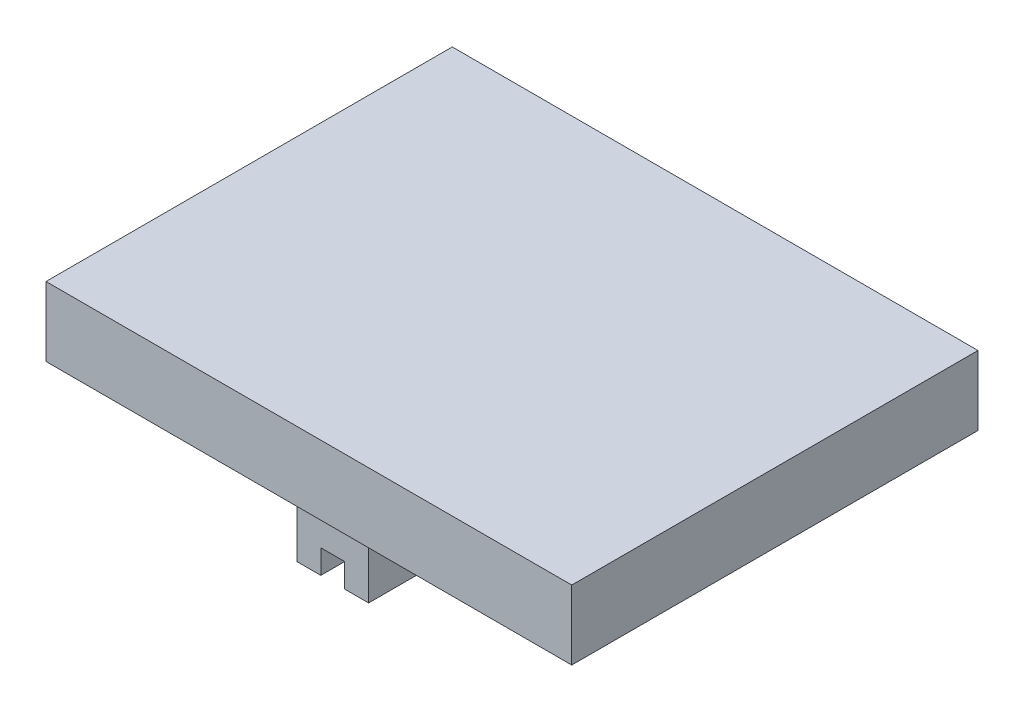
ISO-10303-21;
HEADER;
FILE_DESCRIPTION(('STEP AP214'),'2;1');
FILE_NAME('part.step','',(''),(''),'','','');
FILE_SCHEMA(('AUTOMOTIVE_DESIGN { 1 0 10303 214 1 1 1 1 }'));
ENDSEC;
DATA;
#1=APPLICATION_CONTEXT('core data for automotive mechanical design processes');
#2=APPLICATION_PROTOCOL_DEFINITION('international standard','automotive_design',2000,#1);
#3=PRODUCT_CONTEXT('',#1,'mechanical');
#4=PRODUCT('Part','Part','',(#3));
#5=PRODUCT_RELATED_PRODUCT_CATEGORY('part','',(#4));
#6=PRODUCT_DEFINITION_FORMATION('','',#4);
#7=PRODUCT_DEFINITION_CONTEXT('part definition',#1,'design');
#8=PRODUCT_DEFINITION('design','',#6,#7);
#9=PRODUCT_DEFINITION_SHAPE('','',#8);
#10=(LENGTH_UNIT() NAMED_UNIT(*) SI_UNIT(.MILLI.,.METRE.));
#11=(NAMED_UNIT(*) PLANE_ANGLE_UNIT() SI_UNIT($,.RADIAN.));
#12=(NAMED_UNIT(*) SI_UNIT($,.STERADIAN.) SOLID_ANGLE_UNIT());
#13=UNCERTAINTY_MEASURE_WITH_UNIT(LENGTH_MEASURE(1.E-05),#10,'distance_accuracy_value','');
#14=(GEOMETRIC_REPRESENTATION_CONTEXT(3) GLOBAL_UNCERTAINTY_ASSIGNED_CONTEXT((#13)) GLOBAL_UNIT_ASSIGNED_CONTEXT((#10,
#11,#12)) REPRESENTATION_CONTEXT('',''));
#15=CARTESIAN_POINT('',(0.,0.,0.));
#16=DIRECTION('',(0.,0.,1.));
#17=DIRECTION('',(1.,0.,0.));
#18=AXIS2_PLACEMENT_3D('',#15,#16,#17);
#19=CARTESIAN_POINT('',(0.,3.,15.));
#20=DIRECTION('',(1.,0.,0.));
#21=DIRECTION('',(0.,0.,-1.));
#22=AXIS2_PLACEMENT_3D('',#19,#20,#21);
#23=PLANE('',#22);
#24=DIRECTION('',(0.,-1.,0.));
#25=VECTOR('',#24,1.);
#26=CARTESIAN_POINT('',(0.,3.,0.));
#27=LINE('',#26,#25);
#28=CARTESIAN_POINT('',(0.,3.,0.));
#29=VERTEX_POINT('',#28);
#30=CARTESIAN_POINT('',(0.,0.,0.));
#31=VERTEX_POINT('',#30);
#32=EDGE_CURVE('E127',#29,#31,#27,.T.);
#33=ORIENTED_EDGE('',*,*,#32,.T.);
#34=DIRECTION('',(0.,0.,-1.));
#35=VECTOR('',#34,1.);
#36=CARTESIAN_POINT('',(0.,0.,15.));
#37=LINE('',#36,#35);
#38=CARTESIAN_POINT('',(0.,0.,15.));
#39=VERTEX_POINT('',#38);
#40=EDGE_CURVE('E11',#39,#31,#37,.T.);
#41=ORIENTED_EDGE('',*,*,#40,.F.);
#42=DIRECTION('',(0.,-1.,0.));
#43=VECTOR('',#42,1.);
#44=CARTESIAN_POINT('',(0.,3.,15.));
#45=LINE('',#44,#43);
#46=CARTESIAN_POINT('',(0.,3.,15.));
#47=VERTEX_POINT('',#46);
#48=EDGE_CURVE('E144',#47,#39,#45,.T.);
#49=ORIENTED_EDGE('',*,*,#48,.F.);
#50=DIRECTION('',(0.,0.,-1.));
#51=VECTOR('',#50,1.);
#52=CARTESIAN_POINT('',(0.,3.,15.));
#53=LINE('',#52,#51);
#54=EDGE_CURVE('E123',#47,#29,#53,.T.);
#55=ORIENTED_EDGE('',*,*,#54,.T.);
#56=EDGE_LOOP('',(#33,#41,#49,#55));
#57=FACE_BOUND('',#56,.T.);
#58=ADVANCED_FACE('F34',(#57),#23,.F.);
#59=CARTESIAN_POINT('',(0.,0.,15.));
#60=DIRECTION('',(0.,1.,0.));
#61=DIRECTION('',(0.,0.,1.));
#62=AXIS2_PLACEMENT_3D('',#59,#60,#61);
#63=PLANE('',#62);
#64=DIRECTION('',(1.,0.,0.));
#65=VECTOR('',#64,1.);
#66=CARTESIAN_POINT('',(0.,0.,0.));
#67=LINE('',#66,#65);
#68=CARTESIAN_POINT('',(1.,0.,0.));
#69=VERTEX_POINT('',#68);
#70=EDGE_CURVE('E130',#31,#69,#67,.T.);
#71=ORIENTED_EDGE('',*,*,#70,.T.);
#72=DIRECTION('',(0.,0.,-1.));
#73=VECTOR('',#72,1.);
#74=CARTESIAN_POINT('',(1.,0.,15.));
#75=LINE('',#74,#73);
#76=CARTESIAN_POINT('',(1.,0.,15.));
#77=VERTEX_POINT('',#76);
#78=EDGE_CURVE('E42',#77,#69,#75,.T.);
#79=ORIENTED_EDGE('',*,*,#78,.F.);
#80=DIRECTION('',(1.,0.,0.));
#81=VECTOR('',#80,1.);
#82=CARTESIAN_POINT('',(0.,0.,15.));
#83=LINE('',#82,#81);
#84=EDGE_CURVE('E92',#39,#77,#83,.T.);
#85=ORIENTED_EDGE('',*,*,#84,.F.);
#86=ORIENTED_EDGE('',*,*,#40,.T.);
#87=EDGE_LOOP('',(#71,#79,#85,#86));
#88=FACE_BOUND('',#87,.T.);
#89=ADVANCED_FACE('F255',(#88),#63,.F.);
#90=CARTESIAN_POINT('',(1.,0.,15.));
#91=DIRECTION('',(-1.,0.,0.));
#92=DIRECTION('',(0.,0.,1.));
#93=AXIS2_PLACEMENT_3D('',#90,#91,#92);
#94=PLANE('',#93);
#95=DIRECTION('',(0.,1.,0.));
#96=VECTOR('',#95,1.);
#97=CARTESIAN_POINT('',(1.,0.,0.));
#98=LINE('',#97,#96);
#99=CARTESIAN_POINT('',(1.,1.,0.));
#100=VERTEX_POINT('',#99);
#101=EDGE_CURVE('E133',#69,#100,#98,.T.);
#102=ORIENTED_EDGE('',*,*,#101,.T.);
#103=DIRECTION('',(0.,0.,-1.));
#104=VECTOR('',#103,1.);
#105=CARTESIAN_POINT('',(1.,1.,15.));
#106=LINE('',#105,#104);
#107=CARTESIAN_POINT('',(1.,1.,15.));
#108=VERTEX_POINT('',#107);
#109=EDGE_CURVE('E152',#108,#100,#106,.T.);
#110=ORIENTED_EDGE('',*,*,#109,.F.);
#111=DIRECTION('',(0.,1.,0.));
#112=VECTOR('',#111,1.);
#113=CARTESIAN_POINT('',(1.,0.,15.));
#114=LINE('',#113,#112);
#115=EDGE_CURVE('E160',#77,#108,#114,.T.);
#116=ORIENTED_EDGE('',*,*,#115,.F.);
#117=ORIENTED_EDGE('',*,*,#78,.T.);
#118=EDGE_LOOP('',(#102,#110,#116,#117));
#119=FACE_BOUND('',#118,.T.);
#120=ADVANCED_FACE('F158',(#119),#94,.F.);
#121=CARTESIAN_POINT('',(1.,1.,15.));
#122=DIRECTION('',(0.,1.,0.));
#123=DIRECTION('',(0.,0.,1.));
#124=AXIS2_PLACEMENT_3D('',#121,#122,#123);
#125=PLANE('',#124);
#126=DIRECTION('',(1.,0.,0.));
#127=VECTOR('',#126,1.);
#128=CARTESIAN_POINT('',(1.,1.,0.));
#129=LINE('',#128,#127);
#130=CARTESIAN_POINT('',(2.,1.,0.));
#131=VERTEX_POINT('',#130);
#132=EDGE_CURVE('E135',#100,#131,#129,.T.);
#133=ORIENTED_EDGE('',*,*,#132,.T.);
#134=DIRECTION('',(0.,0.,-1.));
#135=VECTOR('',#134,1.);
#136=CARTESIAN_POINT('',(2.,1.,15.));
#137=LINE('',#136,#135);
#138=CARTESIAN_POINT('',(2.,1.,15.));
#139=VERTEX_POINT('',#138);
#140=EDGE_CURVE('E149',#139,#131,#137,.T.);
#141=ORIENTED_EDGE('',*,*,#140,.F.);
#142=DIRECTION('',(1.,0.,0.));
#143=VECTOR('',#142,1.);
#144=CARTESIAN_POINT('',(1.,1.,15.));
#145=LINE('',#144,#143);
#146=EDGE_CURVE('E172',#108,#139,#145,.T.);
#147=ORIENTED_EDGE('',*,*,#146,.F.);
#148=ORIENTED_EDGE('',*,*,#109,.T.);
#149=EDGE_LOOP('',(#133,#141,#147,#148));
#150=FACE_BOUND('',#149,.T.);
#151=ADVANCED_FACE('F168',(#150),#125,.F.);
#152=CARTESIAN_POINT('',(2.,1.,15.));
#153=DIRECTION('',(1.,0.,0.));
#154=DIRECTION('',(0.,0.,-1.));
#155=AXIS2_PLACEMENT_3D('',#152,#153,#154);
#156=PLANE('',#155);
#157=DIRECTION('',(0.,-1.,0.));
#158=VECTOR('',#157,1.);
#159=CARTESIAN_POINT('',(2.,1.,0.));
#160=LINE('',#159,#158);
#161=CARTESIAN_POINT('',(2.,0.,0.));
#162=VERTEX_POINT('',#161);
#163=EDGE_CURVE('E137',#131,#162,#160,.T.);
#164=ORIENTED_EDGE('',*,*,#163,.T.);
#165=DIRECTION('',(0.,0.,-1.));
#166=VECTOR('',#165,1.);
#167=CARTESIAN_POINT('',(2.,0.,15.));
#168=LINE('',#167,#166);
#169=CARTESIAN_POINT('',(2.,0.,15.));
#170=VERTEX_POINT('',#169);
#171=EDGE_CURVE('E117',#170,#162,#168,.T.);
#172=ORIENTED_EDGE('',*,*,#171,.F.);
#173=DIRECTION('',(0.,-1.,0.));
#174=VECTOR('',#173,1.);
#175=CARTESIAN_POINT('',(2.,1.,15.));
#176=LINE('',#175,#174);
#177=EDGE_CURVE('E112',#139,#170,#176,.T.);
#178=ORIENTED_EDGE('',*,*,#177,.F.);
#179=ORIENTED_EDGE('',*,*,#140,.T.);
#180=EDGE_LOOP('',(#164,#172,#178,#179));
#181=FACE_BOUND('',#180,.T.);
#182=ADVANCED_FACE('F171',(#181),#156,.F.);
#183=CARTESIAN_POINT('',(2.,0.,15.));
#184=DIRECTION('',(0.,1.,0.));
#185=DIRECTION('',(0.,0.,1.));
#186=AXIS2_PLACEMENT_3D('',#183,#184,#185);
#187=PLANE('',#186);
#188=DIRECTION('',(1.,0.,0.));
#189=VECTOR('',#188,1.);
#190=CARTESIAN_POINT('',(2.,0.,0.));
#191=LINE('',#190,#189);
#192=CARTESIAN_POINT('',(3.,0.,0.));
#193=VERTEX_POINT('',#192);
#194=EDGE_CURVE('E77',#162,#193,#191,.T.);
#195=ORIENTED_EDGE('',*,*,#194,.T.);
#196=DIRECTION('',(0.,0.,-1.));
#197=VECTOR('',#196,1.);
#198=CARTESIAN_POINT('',(3.,0.,15.));
#199=LINE('',#198,#197);
#200=CARTESIAN_POINT('',(3.,0.,15.));
#201=VERTEX_POINT('',#200);
#202=EDGE_CURVE('E115',#201,#193,#199,.T.);
#203=ORIENTED_EDGE('',*,*,#202,.F.);
#204=DIRECTION('',(1.,0.,0.));
#205=VECTOR('',#204,1.);
#206=CARTESIAN_POINT('',(2.,0.,15.));
#207=LINE('',#206,#205);
#208=EDGE_CURVE('E107',#170,#201,#207,.T.);
#209=ORIENTED_EDGE('',*,*,#208,.F.);
#210=ORIENTED_EDGE('',*,*,#171,.T.);
#211=EDGE_LOOP('',(#195,#203,#209,#210));
#212=FACE_BOUND('',#211,.T.);
#213=ADVANCED_FACE('F116',(#212),#187,.F.);
#214=CARTESIAN_POINT('',(3.,0.,15.));
#215=DIRECTION('',(-1.,0.,0.));
#216=DIRECTION('',(0.,0.,1.));
#217=AXIS2_PLACEMENT_3D('',#214,#215,#216);
#218=PLANE('',#217);
#219=DIRECTION('',(0.,1.,0.));
#220=VECTOR('',#219,1.);
#221=CARTESIAN_POINT('',(3.,0.,0.));
#222=LINE('',#221,#220);
#223=CARTESIAN_POINT('',(3.,3.,0.));
#224=VERTEX_POINT('',#223);
#225=EDGE_CURVE('E84',#193,#224,#222,.T.);
#226=ORIENTED_EDGE('',*,*,#225,.T.);
#227=DIRECTION('',(0.,0.,-1.));
#228=VECTOR('',#227,1.);
#229=CARTESIAN_POINT('',(3.,3.,15.));
#230=LINE('',#229,#228);
#231=CARTESIAN_POINT('',(3.,3.,15.));
#232=VERTEX_POINT('',#231);
#233=EDGE_CURVE('E118',#232,#224,#230,.T.);
#234=ORIENTED_EDGE('',*,*,#233,.F.);
#235=DIRECTION('',(0.,1.,0.));
#236=VECTOR('',#235,1.);
#237=CARTESIAN_POINT('',(3.,0.,15.));
#238=LINE('',#237,#236);
#239=EDGE_CURVE('E110',#201,#232,#238,.T.);
#240=ORIENTED_EDGE('',*,*,#239,.F.);
#241=ORIENTED_EDGE('',*,*,#202,.T.);
#242=EDGE_LOOP('',(#226,#234,#240,#241));
#243=FACE_BOUND('',#242,.T.);
#244=ADVANCED_FACE('F120',(#243),#218,.F.);
#245=CARTESIAN_POINT('',(0.,0.,15.));
#246=DIRECTION('',(0.,0.,1.));
#247=DIRECTION('',(1.,0.,0.));
#248=AXIS2_PLACEMENT_3D('',#245,#246,#247);
#249=PLANE('',#248);
#250=ORIENTED_EDGE('',*,*,#48,.T.);
#251=ORIENTED_EDGE('',*,*,#84,.T.);
#252=ORIENTED_EDGE('',*,*,#115,.T.);
#253=ORIENTED_EDGE('',*,*,#146,.T.);
#254=ORIENTED_EDGE('',*,*,#177,.T.);
#255=ORIENTED_EDGE('',*,*,#208,.T.);
#256=ORIENTED_EDGE('',*,*,#239,.T.);
#257=DIRECTION('',(-1.,0.,0.));
#258=VECTOR('',#257,1.);
#259=CARTESIAN_POINT('',(3.,3.,15.));
#260=LINE('',#259,#258);
#261=EDGE_CURVE('E50',#232,#47,#260,.T.);
#262=ORIENTED_EDGE('',*,*,#261,.T.);
#263=EDGE_LOOP('',(#250,#251,#252,#253,#254,#255,#256,#262));
#264=FACE_BOUND('',#263,.T.);
#265=ADVANCED_FACE('F108',(#264),#249,.T.);
#266=CARTESIAN_POINT('',(0.,0.,0.));
#267=DIRECTION('',(0.,0.,1.));
#268=DIRECTION('',(1.,0.,0.));
#269=AXIS2_PLACEMENT_3D('',#266,#267,#268);
#270=PLANE('',#269);
#271=ORIENTED_EDGE('',*,*,#32,.F.);
#272=DIRECTION('',(-1.,0.,0.));
#273=VECTOR('',#272,1.);
#274=CARTESIAN_POINT('',(3.,3.,0.));
#275=LINE('',#274,#273);
#276=EDGE_CURVE('E141',#224,#29,#275,.T.);
#277=ORIENTED_EDGE('',*,*,#276,.F.);
#278=ORIENTED_EDGE('',*,*,#225,.F.);
#279=ORIENTED_EDGE('',*,*,#194,.F.);
#280=ORIENTED_EDGE('',*,*,#163,.F.);
#281=ORIENTED_EDGE('',*,*,#132,.F.);
#282=ORIENTED_EDGE('',*,*,#101,.F.);
#283=ORIENTED_EDGE('',*,*,#70,.F.);
#284=EDGE_LOOP('',(#271,#277,#278,#279,#280,#281,#282,#283));
#285=FACE_BOUND('',#284,.T.);
#286=ADVANCED_FACE('F164',(#285),#270,.F.);
#287=CARTESIAN_POINT('',(-9.5,5.9,-1.));
#288=DIRECTION('',(1.,0.,0.));
#289=DIRECTION('',(0.,1.,0.));
#290=AXIS2_PLACEMENT_3D('',#287,#288,#289);
#291=PLANE('',#290);
#292=DIRECTION('',(0.,0.,1.));
#293=VECTOR('',#292,1.);
#294=CARTESIAN_POINT('',(-9.5,3.,-1.));
#295=LINE('',#294,#293);
#296=CARTESIAN_POINT('',(-9.5,3.,-1.));
#297=VERTEX_POINT('',#296);
#298=CARTESIAN_POINT('',(-9.5,3.,16.));
#299=VERTEX_POINT('',#298);
#300=EDGE_CURVE('E200',#297,#299,#295,.T.);
#301=ORIENTED_EDGE('',*,*,#300,.T.);
#302=DIRECTION('',(0.,-1.,0.));
#303=VECTOR('',#302,1.);
#304=CARTESIAN_POINT('',(-9.5,5.9,16.));
#305=LINE('',#304,#303);
#306=CARTESIAN_POINT('',(-9.5,5.9,16.));
#307=VERTEX_POINT('',#306);
#308=EDGE_CURVE('E131',#307,#299,#305,.T.);
#309=ORIENTED_EDGE('',*,*,#308,.F.);
#310=DIRECTION('',(0.,0.,1.));
#311=VECTOR('',#310,1.);
#312=CARTESIAN_POINT('',(-9.5,5.9,-1.));
#313=LINE('',#312,#311);
#314=CARTESIAN_POINT('',(-9.5,5.9,-1.));
#315=VERTEX_POINT('',#314);
#316=EDGE_CURVE('E193',#315,#307,#313,.T.);
#317=ORIENTED_EDGE('',*,*,#316,.F.);
#318=DIRECTION('',(0.,-1.,0.));
#319=VECTOR('',#318,1.);
#320=CARTESIAN_POINT('',(-9.5,5.9,-1.));
#321=LINE('',#320,#319);
#322=EDGE_CURVE('E186',#315,#297,#321,.T.);
#323=ORIENTED_EDGE('',*,*,#322,.T.);
#324=EDGE_LOOP('',(#301,#309,#317,#323));
#325=FACE_BOUND('',#324,.T.);
#326=ADVANCED_FACE('F226',(#325),#291,.F.);
#327=CARTESIAN_POINT('',(-9.5,5.9,16.));
#328=DIRECTION('',(0.,0.,-1.));
#329=DIRECTION('',(-1.,0.,0.));
#330=AXIS2_PLACEMENT_3D('',#327,#328,#329);
#331=PLANE('',#330);
#332=DIRECTION('',(1.,0.,0.));
#333=VECTOR('',#332,1.);
#334=CARTESIAN_POINT('',(-9.5,3.,16.));
#335=LINE('',#334,#333);
#336=CARTESIAN_POINT('',(12.5,3.,16.));
#337=VERTEX_POINT('',#336);
#338=EDGE_CURVE('E197',#299,#337,#335,.T.);
#339=ORIENTED_EDGE('',*,*,#338,.T.);
#340=DIRECTION('',(0.,-1.,0.));
#341=VECTOR('',#340,1.);
#342=CARTESIAN_POINT('',(12.5,5.9,16.));
#343=LINE('',#342,#341);
#344=CARTESIAN_POINT('',(12.5,5.9,16.));
#345=VERTEX_POINT('',#344);
#346=EDGE_CURVE('E180',#345,#337,#343,.T.);
#347=ORIENTED_EDGE('',*,*,#346,.F.);
#348=DIRECTION('',(1.,0.,0.));
#349=VECTOR('',#348,1.);
#350=CARTESIAN_POINT('',(-9.5,5.9,16.));
#351=LINE('',#350,#349);
#352=EDGE_CURVE('E208',#307,#345,#351,.T.);
#353=ORIENTED_EDGE('',*,*,#352,.F.);
#354=ORIENTED_EDGE('',*,*,#308,.T.);
#355=EDGE_LOOP('',(#339,#347,#353,#354));
#356=FACE_BOUND('',#355,.T.);
#357=ADVANCED_FACE('F230',(#356),#331,.F.);
#358=CARTESIAN_POINT('',(12.5,5.9,-1.));
#359=DIRECTION('',(-1.,0.,0.));
#360=DIRECTION('',(0.,-1.,0.));
#361=AXIS2_PLACEMENT_3D('',#358,#359,#360);
#362=PLANE('',#361);
#363=DIRECTION('',(0.,0.,-1.));
#364=VECTOR('',#363,1.);
#365=CARTESIAN_POINT('',(12.5,3.,-1.));
#366=LINE('',#365,#364);
#367=CARTESIAN_POINT('',(12.5,3.,-1.));
#368=VERTEX_POINT('',#367);
#369=EDGE_CURVE('E194',#337,#368,#366,.T.);
#370=ORIENTED_EDGE('',*,*,#369,.T.);
#371=DIRECTION('',(0.,-1.,0.));
#372=VECTOR('',#371,1.);
#373=CARTESIAN_POINT('',(12.5,5.9,-1.));
#374=LINE('',#373,#372);
#375=CARTESIAN_POINT('',(12.5,5.9,-1.));
#376=VERTEX_POINT('',#375);
#377=EDGE_CURVE('E183',#376,#368,#374,.T.);
#378=ORIENTED_EDGE('',*,*,#377,.F.);
#379=DIRECTION('',(0.,0.,-1.));
#380=VECTOR('',#379,1.);
#381=CARTESIAN_POINT('',(12.5,5.9,-1.));
#382=LINE('',#381,#380);
#383=EDGE_CURVE('E205',#345,#376,#382,.T.);
#384=ORIENTED_EDGE('',*,*,#383,.F.);
#385=ORIENTED_EDGE('',*,*,#346,.T.);
#386=EDGE_LOOP('',(#370,#378,#384,#385));
#387=FACE_BOUND('',#386,.T.);
#388=ADVANCED_FACE('F266',(#387),#362,.F.);
#389=CARTESIAN_POINT('',(-9.5,5.9,-1.));
#390=DIRECTION('',(0.,0.,1.));
#391=DIRECTION('',(1.,0.,0.));
#392=AXIS2_PLACEMENT_3D('',#389,#390,#391);
#393=PLANE('',#392);
#394=DIRECTION('',(-1.,0.,0.));
#395=VECTOR('',#394,1.);
#396=CARTESIAN_POINT('',(-9.5,3.,-1.));
#397=LINE('',#396,#395);
#398=EDGE_CURVE('E190',#368,#297,#397,.T.);
#399=ORIENTED_EDGE('',*,*,#398,.T.);
#400=ORIENTED_EDGE('',*,*,#322,.F.);
#401=DIRECTION('',(-1.,0.,0.));
#402=VECTOR('',#401,1.);
#403=CARTESIAN_POINT('',(-9.5,5.9,-1.));
#404=LINE('',#403,#402);
#405=EDGE_CURVE('E189',#376,#315,#404,.T.);
#406=ORIENTED_EDGE('',*,*,#405,.F.);
#407=ORIENTED_EDGE('',*,*,#377,.T.);
#408=EDGE_LOOP('',(#399,#400,#406,#407));
#409=FACE_BOUND('',#408,.T.);
#410=ADVANCED_FACE('F243',(#409),#393,.F.);
#411=CARTESIAN_POINT('',(0.,5.9,0.));
#412=DIRECTION('',(0.,1.,0.));
#413=DIRECTION('',(-1.,0.,0.));
#414=AXIS2_PLACEMENT_3D('',#411,#412,#413);
#415=PLANE('',#414);
#416=ORIENTED_EDGE('',*,*,#316,.T.);
#417=ORIENTED_EDGE('',*,*,#352,.T.);
#418=ORIENTED_EDGE('',*,*,#383,.T.);
#419=ORIENTED_EDGE('',*,*,#405,.T.);
#420=EDGE_LOOP('',(#416,#417,#418,#419));
#421=FACE_BOUND('',#420,.T.);
#422=ADVANCED_FACE('F216',(#421),#415,.T.);
#423=CARTESIAN_POINT('',(0.,3.,0.));
#424=DIRECTION('',(0.,1.,0.));
#425=DIRECTION('',(-1.,0.,0.));
#426=AXIS2_PLACEMENT_3D('',#423,#424,#425);
#427=PLANE('',#426);
#428=ORIENTED_EDGE('',*,*,#261,.F.);
#429=ORIENTED_EDGE('',*,*,#233,.T.);
#430=ORIENTED_EDGE('',*,*,#276,.T.);
#431=ORIENTED_EDGE('',*,*,#54,.F.);
#432=EDGE_LOOP('',(#428,#429,#430,#431));
#433=FACE_BOUND('',#432,.T.);
#434=ORIENTED_EDGE('',*,*,#300,.F.);
#435=ORIENTED_EDGE('',*,*,#398,.F.);
#436=ORIENTED_EDGE('',*,*,#369,.F.);
#437=ORIENTED_EDGE('',*,*,#338,.F.);
#438=EDGE_LOOP('',(#434,#435,#436,#437));
#439=FACE_BOUND('',#438,.T.);
#440=ADVANCED_FACE('F245',(#433,#439),#427,.F.);
#441=CLOSED_SHELL('',(#58,#89,#120,#151,#182,#213,#244,#265,#286,#326,#357,#388,#410,#422,#440));
#442=MANIFOLD_SOLID_BREP('B2',#441);
#443=ADVANCED_BREP_SHAPE_REPRESENTATION('',(#18,#442),#14);
#444=SHAPE_DEFINITION_REPRESENTATION(#9,#443);
ENDSEC;
END-ISO-10303-21;
